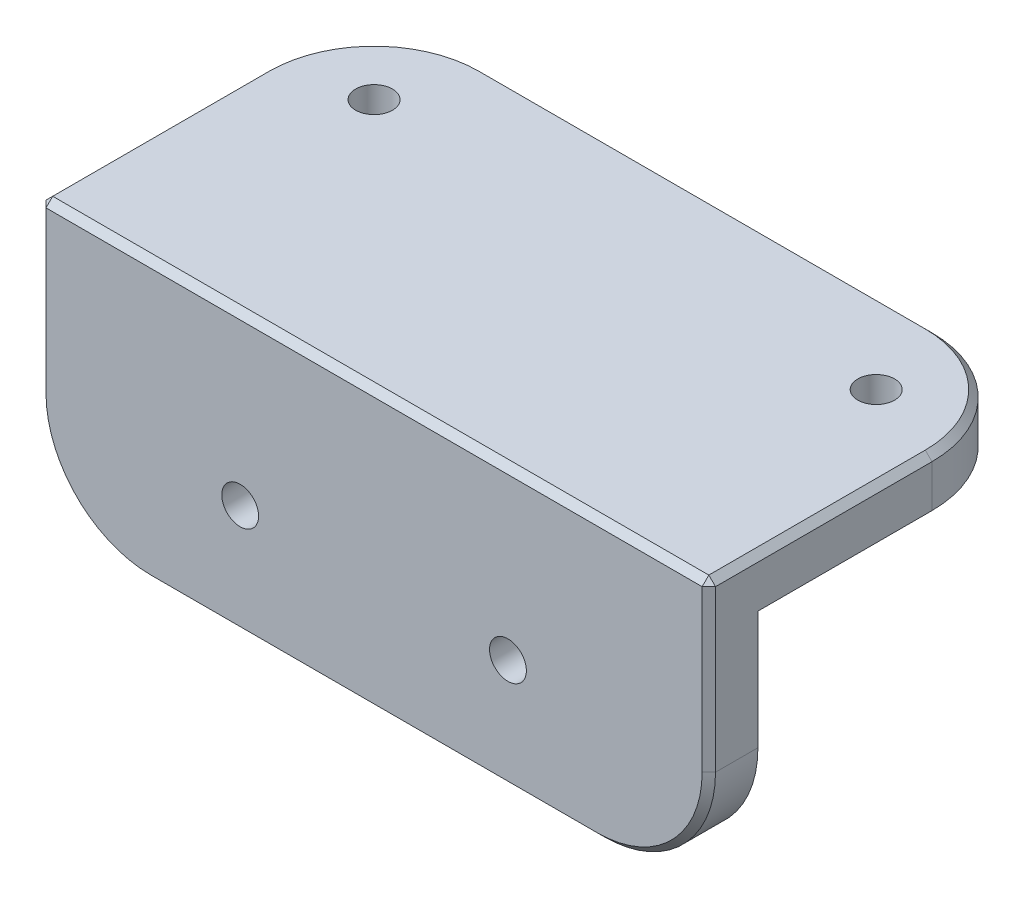
ISO-10303-21;
HEADER;
FILE_DESCRIPTION(('STEP AP214'),'2;1');
FILE_NAME('part.step','',(''),(''),'','','');
FILE_SCHEMA(('AUTOMOTIVE_DESIGN { 1 0 10303 214 1 1 1 1 }'));
ENDSEC;
DATA;
#1=APPLICATION_CONTEXT('core data for automotive mechanical design processes');
#2=APPLICATION_PROTOCOL_DEFINITION('international standard','automotive_design',2000,#1);
#3=PRODUCT_CONTEXT('',#1,'mechanical');
#4=PRODUCT('Part','Part','',(#3));
#5=PRODUCT_RELATED_PRODUCT_CATEGORY('part','',(#4));
#6=PRODUCT_DEFINITION_FORMATION('','',#4);
#7=PRODUCT_DEFINITION_CONTEXT('part definition',#1,'design');
#8=PRODUCT_DEFINITION('design','',#6,#7);
#9=PRODUCT_DEFINITION_SHAPE('','',#8);
#10=(LENGTH_UNIT() NAMED_UNIT(*) SI_UNIT(.MILLI.,.METRE.));
#11=(NAMED_UNIT(*) PLANE_ANGLE_UNIT() SI_UNIT($,.RADIAN.));
#12=(NAMED_UNIT(*) SI_UNIT($,.STERADIAN.) SOLID_ANGLE_UNIT());
#13=UNCERTAINTY_MEASURE_WITH_UNIT(LENGTH_MEASURE(1.E-05),#10,'distance_accuracy_value','');
#14=(GEOMETRIC_REPRESENTATION_CONTEXT(3) GLOBAL_UNCERTAINTY_ASSIGNED_CONTEXT((#13)) GLOBAL_UNIT_ASSIGNED_CONTEXT((#10,
#11,#12)) REPRESENTATION_CONTEXT('',''));
#15=CARTESIAN_POINT('',(0.,0.,0.));
#16=DIRECTION('',(0.,0.,1.));
#17=DIRECTION('',(1.,0.,0.));
#18=AXIS2_PLACEMENT_3D('',#15,#16,#17);
#19=CARTESIAN_POINT('',(30.,5.,15.));
#20=DIRECTION('',(-1.,0.,0.));
#21=DIRECTION('',(0.,0.,1.));
#22=AXIS2_PLACEMENT_3D('',#19,#20,#21);
#23=PLANE('',#22);
#24=DIRECTION('',(0.,1.,0.));
#25=VECTOR('',#24,1.);
#26=CARTESIAN_POINT('',(30.,5.,10.6));
#27=LINE('',#26,#25);
#28=CARTESIAN_POINT('',(30.,-10.,10.6));
#29=VERTEX_POINT('',#28);
#30=CARTESIAN_POINT('',(30.,0.600000000000003,10.6));
#31=VERTEX_POINT('',#30);
#32=EDGE_CURVE('E358',#29,#31,#27,.T.);
#33=ORIENTED_EDGE('',*,*,#32,.T.);
#34=DIRECTION('',(0.,0.,-1.));
#35=VECTOR('',#34,1.);
#36=CARTESIAN_POINT('',(30.,0.600000000000003,-5.));
#37=LINE('',#36,#35);
#38=CARTESIAN_POINT('',(30.,0.600000000000003,-5.));
#39=VERTEX_POINT('',#38);
#40=EDGE_CURVE('E355',#31,#39,#37,.T.);
#41=ORIENTED_EDGE('',*,*,#40,.T.);
#42=DIRECTION('',(0.,-1.,0.));
#43=VECTOR('',#42,1.);
#44=CARTESIAN_POINT('',(30.,5.,-5.));
#45=LINE('',#44,#43);
#46=CARTESIAN_POINT('',(30.,4.4,-5.));
#47=VERTEX_POINT('',#46);
#48=EDGE_CURVE('E211',#39,#47,#45,.F.);
#49=ORIENTED_EDGE('',*,*,#48,.T.);
#50=DIRECTION('',(0.,0.,1.));
#51=VECTOR('',#50,1.);
#52=CARTESIAN_POINT('',(30.,4.4,15.));
#53=LINE('',#52,#51);
#54=CARTESIAN_POINT('',(30.,4.4,14.4));
#55=VERTEX_POINT('',#54);
#56=EDGE_CURVE('E361',#47,#55,#53,.T.);
#57=ORIENTED_EDGE('',*,*,#56,.T.);
#58=DIRECTION('',(0.,-1.,0.));
#59=VECTOR('',#58,1.);
#60=CARTESIAN_POINT('',(30.,5.,14.4));
#61=LINE('',#60,#59);
#62=CARTESIAN_POINT('',(30.,-10.,14.4));
#63=VERTEX_POINT('',#62);
#64=EDGE_CURVE('E364',#55,#63,#61,.T.);
#65=ORIENTED_EDGE('',*,*,#64,.T.);
#66=DIRECTION('',(0.,0.,1.));
#67=VECTOR('',#66,1.);
#68=CARTESIAN_POINT('',(30.,-10.,10.));
#69=LINE('',#68,#67);
#70=EDGE_CURVE('E444',#63,#29,#69,.F.);
#71=ORIENTED_EDGE('',*,*,#70,.T.);
#72=EDGE_LOOP('',(#33,#41,#49,#57,#65,#71));
#73=FACE_BOUND('',#72,.T.);
#74=ADVANCED_FACE('F41',(#73),#23,.F.);
#75=CARTESIAN_POINT('',(-30.,5.,-15.));
#76=DIRECTION('',(0.,0.,1.));
#77=DIRECTION('',(1.,0.,0.));
#78=AXIS2_PLACEMENT_3D('',#75,#76,#77);
#79=PLANE('',#78);
#80=DIRECTION('',(0.,-1.,0.));
#81=VECTOR('',#80,1.);
#82=CARTESIAN_POINT('',(20.,5.,-15.));
#83=LINE('',#82,#81);
#84=CARTESIAN_POINT('',(20.,4.4,-15.));
#85=VERTEX_POINT('',#84);
#86=CARTESIAN_POINT('',(20.,0.600000000000003,-15.));
#87=VERTEX_POINT('',#86);
#88=EDGE_CURVE('E440',#85,#87,#83,.T.);
#89=ORIENTED_EDGE('',*,*,#88,.T.);
#90=DIRECTION('',(-1.,0.,0.));
#91=VECTOR('',#90,1.);
#92=CARTESIAN_POINT('',(-20.,0.600000000000003,-15.));
#93=LINE('',#92,#91);
#94=CARTESIAN_POINT('',(-20.,0.600000000000003,-15.));
#95=VERTEX_POINT('',#94);
#96=EDGE_CURVE('E385',#87,#95,#93,.T.);
#97=ORIENTED_EDGE('',*,*,#96,.T.);
#98=DIRECTION('',(0.,-1.,0.));
#99=VECTOR('',#98,1.);
#100=CARTESIAN_POINT('',(-20.,5.,-15.));
#101=LINE('',#100,#99);
#102=CARTESIAN_POINT('',(-20.,4.4,-15.));
#103=VERTEX_POINT('',#102);
#104=EDGE_CURVE('E436',#95,#103,#101,.F.);
#105=ORIENTED_EDGE('',*,*,#104,.T.);
#106=DIRECTION('',(1.,0.,0.));
#107=VECTOR('',#106,1.);
#108=CARTESIAN_POINT('',(-30.,4.4,-15.));
#109=LINE('',#108,#107);
#110=EDGE_CURVE('E224',#103,#85,#109,.T.);
#111=ORIENTED_EDGE('',*,*,#110,.T.);
#112=EDGE_LOOP('',(#89,#97,#105,#111));
#113=FACE_BOUND('',#112,.T.);
#114=ADVANCED_FACE('F566',(#113),#79,.F.);
#115=CARTESIAN_POINT('',(-30.,5.,15.));
#116=DIRECTION('',(1.,0.,0.));
#117=DIRECTION('',(0.,0.,-1.));
#118=AXIS2_PLACEMENT_3D('',#115,#116,#117);
#119=PLANE('',#118);
#120=DIRECTION('',(0.,-1.,0.));
#121=VECTOR('',#120,1.);
#122=CARTESIAN_POINT('',(-30.,5.,-5.));
#123=LINE('',#122,#121);
#124=CARTESIAN_POINT('',(-30.,4.4,-5.));
#125=VERTEX_POINT('',#124);
#126=CARTESIAN_POINT('',(-30.,0.600000000000003,-5.));
#127=VERTEX_POINT('',#126);
#128=EDGE_CURVE('E212',#125,#127,#123,.T.);
#129=ORIENTED_EDGE('',*,*,#128,.T.);
#130=DIRECTION('',(0.,0.,1.));
#131=VECTOR('',#130,1.);
#132=CARTESIAN_POINT('',(-30.,0.600000000000003,10.));
#133=LINE('',#132,#131);
#134=CARTESIAN_POINT('',(-30.,0.600000000000003,10.6));
#135=VERTEX_POINT('',#134);
#136=EDGE_CURVE('E195',#127,#135,#133,.T.);
#137=ORIENTED_EDGE('',*,*,#136,.T.);
#138=DIRECTION('',(0.,-1.,0.));
#139=VECTOR('',#138,1.);
#140=CARTESIAN_POINT('',(-30.,5.,10.6));
#141=LINE('',#140,#139);
#142=CARTESIAN_POINT('',(-30.,-10.,10.6));
#143=VERTEX_POINT('',#142);
#144=EDGE_CURVE('E189',#135,#143,#141,.T.);
#145=ORIENTED_EDGE('',*,*,#144,.T.);
#146=DIRECTION('',(0.,0.,-1.));
#147=VECTOR('',#146,1.);
#148=CARTESIAN_POINT('',(-30.,-10.,15.));
#149=LINE('',#148,#147);
#150=CARTESIAN_POINT('',(-30.,-10.,14.4));
#151=VERTEX_POINT('',#150);
#152=EDGE_CURVE('E193',#143,#151,#149,.F.);
#153=ORIENTED_EDGE('',*,*,#152,.T.);
#154=DIRECTION('',(0.,1.,0.));
#155=VECTOR('',#154,1.);
#156=CARTESIAN_POINT('',(-30.,5.,14.4));
#157=LINE('',#156,#155);
#158=CARTESIAN_POINT('',(-30.,4.4,14.4));
#159=VERTEX_POINT('',#158);
#160=EDGE_CURVE('E433',#151,#159,#157,.T.);
#161=ORIENTED_EDGE('',*,*,#160,.T.);
#162=DIRECTION('',(0.,0.,-1.));
#163=VECTOR('',#162,1.);
#164=CARTESIAN_POINT('',(-30.,4.4,15.));
#165=LINE('',#164,#163);
#166=EDGE_CURVE('E200',#159,#125,#165,.T.);
#167=ORIENTED_EDGE('',*,*,#166,.T.);
#168=EDGE_LOOP('',(#129,#137,#145,#153,#161,#167));
#169=FACE_BOUND('',#168,.T.);
#170=ADVANCED_FACE('F192',(#169),#119,.F.);
#171=CARTESIAN_POINT('',(-30.,5.,15.));
#172=DIRECTION('',(0.,0.,-1.));
#173=DIRECTION('',(-1.,0.,0.));
#174=AXIS2_PLACEMENT_3D('',#171,#172,#173);
#175=PLANE('',#174);
#176=DIRECTION('',(-1.,0.,0.));
#177=VECTOR('',#176,1.);
#178=CARTESIAN_POINT('',(-30.,4.4,15.));
#179=LINE('',#178,#177);
#180=CARTESIAN_POINT('',(29.4,4.4,15.));
#181=VERTEX_POINT('',#180);
#182=CARTESIAN_POINT('',(-29.4,4.4,15.));
#183=VERTEX_POINT('',#182);
#184=EDGE_CURVE('E333',#181,#183,#179,.T.);
#185=ORIENTED_EDGE('',*,*,#184,.T.);
#186=DIRECTION('',(0.,-1.,0.));
#187=VECTOR('',#186,1.);
#188=CARTESIAN_POINT('',(-29.4,5.,15.));
#189=LINE('',#188,#187);
#190=CARTESIAN_POINT('',(-29.4,-10.,15.));
#191=VERTEX_POINT('',#190);
#192=EDGE_CURVE('E11',#183,#191,#189,.T.);
#193=ORIENTED_EDGE('',*,*,#192,.T.);
#194=CARTESIAN_POINT('',(-20.,-10.,15.));
#195=DIRECTION('',(0.,0.,-1.));
#196=DIRECTION('',(-1.,0.,0.));
#197=AXIS2_PLACEMENT_3D('',#194,#195,#196);
#198=CIRCLE('',#197,9.4);
#199=CARTESIAN_POINT('',(-20.,-19.4,15.));
#200=VERTEX_POINT('',#199);
#201=EDGE_CURVE('E52',#191,#200,#198,.F.);
#202=ORIENTED_EDGE('',*,*,#201,.T.);
#203=DIRECTION('',(1.,0.,0.));
#204=VECTOR('',#203,1.);
#205=CARTESIAN_POINT('',(20.,-19.4,15.));
#206=LINE('',#205,#204);
#207=CARTESIAN_POINT('',(20.,-19.4,15.));
#208=VERTEX_POINT('',#207);
#209=EDGE_CURVE('E324',#200,#208,#206,.T.);
#210=ORIENTED_EDGE('',*,*,#209,.T.);
#211=CARTESIAN_POINT('',(20.,-10.,15.));
#212=DIRECTION('',(0.,0.,-1.));
#213=DIRECTION('',(-1.,0.,0.));
#214=AXIS2_PLACEMENT_3D('',#211,#212,#213);
#215=CIRCLE('',#214,9.40000000000001);
#216=CARTESIAN_POINT('',(29.4,-10.,15.));
#217=VERTEX_POINT('',#216);
#218=EDGE_CURVE('E327',#208,#217,#215,.F.);
#219=ORIENTED_EDGE('',*,*,#218,.T.);
#220=DIRECTION('',(0.,1.,0.));
#221=VECTOR('',#220,1.);
#222=CARTESIAN_POINT('',(29.4,5.,15.));
#223=LINE('',#222,#221);
#224=EDGE_CURVE('E330',#217,#181,#223,.T.);
#225=ORIENTED_EDGE('',*,*,#224,.T.);
#226=EDGE_LOOP('',(#185,#193,#202,#210,#219,#225));
#227=FACE_BOUND('',#226,.T.);
#228=CARTESIAN_POINT('',(12.,-10.,15.));
#229=DIRECTION('',(0.,0.,-1.));
#230=DIRECTION('',(-1.,0.,0.));
#231=AXIS2_PLACEMENT_3D('',#228,#229,#230);
#232=CIRCLE('',#231,1.65);
#233=CARTESIAN_POINT('',(10.35,-10.,15.));
#234=VERTEX_POINT('',#233);
#235=EDGE_CURVE('E480',#234,#234,#232,.T.);
#236=ORIENTED_EDGE('',*,*,#235,.T.);
#237=EDGE_LOOP('',(#236));
#238=FACE_BOUND('',#237,.T.);
#239=CARTESIAN_POINT('',(-12.,-10.,15.));
#240=DIRECTION('',(0.,0.,-1.));
#241=DIRECTION('',(-1.,0.,0.));
#242=AXIS2_PLACEMENT_3D('',#239,#240,#241);
#243=CIRCLE('',#242,1.65);
#244=CARTESIAN_POINT('',(-13.65,-10.,15.));
#245=VERTEX_POINT('',#244);
#246=EDGE_CURVE('E484',#245,#245,#243,.T.);
#247=ORIENTED_EDGE('',*,*,#246,.T.);
#248=EDGE_LOOP('',(#247));
#249=FACE_BOUND('',#248,.T.);
#250=ADVANCED_FACE('F631',(#227,#238,#249),#175,.F.);
#251=CARTESIAN_POINT('',(0.,5.,0.));
#252=DIRECTION('',(0.,-1.,0.));
#253=DIRECTION('',(0.,0.,-1.));
#254=AXIS2_PLACEMENT_3D('',#251,#252,#253);
#255=PLANE('',#254);
#256=CARTESIAN_POINT('',(-20.,5.,-5.));
#257=DIRECTION('',(0.,-1.,0.));
#258=DIRECTION('',(0.,0.,-1.));
#259=AXIS2_PLACEMENT_3D('',#256,#257,#258);
#260=CIRCLE('',#259,9.40000000000001);
#261=CARTESIAN_POINT('',(-20.,5.,-14.4));
#262=VERTEX_POINT('',#261);
#263=CARTESIAN_POINT('',(-29.4,5.,-5.));
#264=VERTEX_POINT('',#263);
#265=EDGE_CURVE('E340',#262,#264,#260,.F.);
#266=ORIENTED_EDGE('',*,*,#265,.T.);
#267=DIRECTION('',(0.,0.,1.));
#268=VECTOR('',#267,1.);
#269=CARTESIAN_POINT('',(-29.4,5.,0.));
#270=LINE('',#269,#268);
#271=CARTESIAN_POINT('',(-29.4,5.,14.4));
#272=VERTEX_POINT('',#271);
#273=EDGE_CURVE('E336',#264,#272,#270,.T.);
#274=ORIENTED_EDGE('',*,*,#273,.T.);
#275=DIRECTION('',(1.,0.,0.));
#276=VECTOR('',#275,1.);
#277=CARTESIAN_POINT('',(0.,5.,14.4));
#278=LINE('',#277,#276);
#279=CARTESIAN_POINT('',(29.4,5.,14.4));
#280=VERTEX_POINT('',#279);
#281=EDGE_CURVE('E352',#272,#280,#278,.T.);
#282=ORIENTED_EDGE('',*,*,#281,.T.);
#283=DIRECTION('',(0.,0.,-1.));
#284=VECTOR('',#283,1.);
#285=CARTESIAN_POINT('',(29.4,5.,0.));
#286=LINE('',#285,#284);
#287=CARTESIAN_POINT('',(29.4,5.,-5.));
#288=VERTEX_POINT('',#287);
#289=EDGE_CURVE('E349',#280,#288,#286,.T.);
#290=ORIENTED_EDGE('',*,*,#289,.T.);
#291=CARTESIAN_POINT('',(20.,5.,-5.));
#292=DIRECTION('',(0.,-1.,0.));
#293=DIRECTION('',(0.,0.,-1.));
#294=AXIS2_PLACEMENT_3D('',#291,#292,#293);
#295=CIRCLE('',#294,9.4);
#296=CARTESIAN_POINT('',(20.,5.,-14.4));
#297=VERTEX_POINT('',#296);
#298=EDGE_CURVE('E346',#288,#297,#295,.F.);
#299=ORIENTED_EDGE('',*,*,#298,.T.);
#300=DIRECTION('',(-1.,0.,0.));
#301=VECTOR('',#300,1.);
#302=CARTESIAN_POINT('',(0.,5.,-14.4));
#303=LINE('',#302,#301);
#304=EDGE_CURVE('E343',#297,#262,#303,.T.);
#305=ORIENTED_EDGE('',*,*,#304,.T.);
#306=EDGE_LOOP('',(#266,#274,#282,#290,#299,#305));
#307=FACE_BOUND('',#306,.T.);
#308=CARTESIAN_POINT('',(-22.5,5.,-7.5));
#309=DIRECTION('',(0.,1.,0.));
#310=DIRECTION('',(0.,0.,1.));
#311=AXIS2_PLACEMENT_3D('',#308,#309,#310);
#312=CIRCLE('',#311,1.65);
#313=CARTESIAN_POINT('',(-22.5,5.,-5.85));
#314=VERTEX_POINT('',#313);
#315=EDGE_CURVE('E470',#314,#314,#312,.T.);
#316=ORIENTED_EDGE('',*,*,#315,.F.);
#317=EDGE_LOOP('',(#316));
#318=FACE_BOUND('',#317,.T.);
#319=CARTESIAN_POINT('',(22.5,5.,-7.5));
#320=DIRECTION('',(0.,1.,0.));
#321=DIRECTION('',(0.,0.,1.));
#322=AXIS2_PLACEMENT_3D('',#319,#320,#321);
#323=CIRCLE('',#322,1.65);
#324=CARTESIAN_POINT('',(22.5,5.,-5.85));
#325=VERTEX_POINT('',#324);
#326=EDGE_CURVE('E461',#325,#325,#323,.T.);
#327=ORIENTED_EDGE('',*,*,#326,.F.);
#328=EDGE_LOOP('',(#327));
#329=FACE_BOUND('',#328,.T.);
#330=ADVANCED_FACE('F615',(#307,#318,#329),#255,.F.);
#331=CARTESIAN_POINT('',(0.,0.,0.));
#332=DIRECTION('',(0.,-1.,0.));
#333=DIRECTION('',(0.,0.,-1.));
#334=AXIS2_PLACEMENT_3D('',#331,#332,#333);
#335=PLANE('',#334);
#336=DIRECTION('',(1.,0.,0.));
#337=VECTOR('',#336,1.);
#338=CARTESIAN_POINT('',(-30.,0.,10.));
#339=LINE('',#338,#337);
#340=CARTESIAN_POINT('',(-29.4,0.,10.));
#341=VERTEX_POINT('',#340);
#342=CARTESIAN_POINT('',(29.4,0.,10.));
#343=VERTEX_POINT('',#342);
#344=EDGE_CURVE('E466',#341,#343,#339,.T.);
#345=ORIENTED_EDGE('',*,*,#344,.F.);
#346=DIRECTION('',(0.,0.,-1.));
#347=VECTOR('',#346,1.);
#348=CARTESIAN_POINT('',(-29.4,0.,-5.));
#349=LINE('',#348,#347);
#350=CARTESIAN_POINT('',(-29.4,0.,-5.));
#351=VERTEX_POINT('',#350);
#352=EDGE_CURVE('E412',#341,#351,#349,.T.);
#353=ORIENTED_EDGE('',*,*,#352,.T.);
#354=CARTESIAN_POINT('',(-20.,0.,-5.));
#355=DIRECTION('',(0.,-1.,0.));
#356=DIRECTION('',(0.,0.,-1.));
#357=AXIS2_PLACEMENT_3D('',#354,#355,#356);
#358=CIRCLE('',#357,9.39999999999999);
#359=CARTESIAN_POINT('',(-20.,0.,-14.4));
#360=VERTEX_POINT('',#359);
#361=EDGE_CURVE('E416',#351,#360,#358,.T.);
#362=ORIENTED_EDGE('',*,*,#361,.T.);
#363=DIRECTION('',(1.,0.,0.));
#364=VECTOR('',#363,1.);
#365=CARTESIAN_POINT('',(20.,0.,-14.4));
#366=LINE('',#365,#364);
#367=CARTESIAN_POINT('',(20.,0.,-14.4));
#368=VERTEX_POINT('',#367);
#369=EDGE_CURVE('E419',#360,#368,#366,.T.);
#370=ORIENTED_EDGE('',*,*,#369,.T.);
#371=CARTESIAN_POINT('',(20.,0.,-5.));
#372=DIRECTION('',(0.,-1.,0.));
#373=DIRECTION('',(0.,0.,-1.));
#374=AXIS2_PLACEMENT_3D('',#371,#372,#373);
#375=CIRCLE('',#374,9.39999999999999);
#376=CARTESIAN_POINT('',(29.4,0.,-5.));
#377=VERTEX_POINT('',#376);
#378=EDGE_CURVE('E422',#368,#377,#375,.T.);
#379=ORIENTED_EDGE('',*,*,#378,.T.);
#380=DIRECTION('',(0.,0.,1.));
#381=VECTOR('',#380,1.);
#382=CARTESIAN_POINT('',(29.4,0.,10.));
#383=LINE('',#382,#381);
#384=EDGE_CURVE('E425',#377,#343,#383,.T.);
#385=ORIENTED_EDGE('',*,*,#384,.T.);
#386=EDGE_LOOP('',(#345,#353,#362,#370,#379,#385));
#387=FACE_BOUND('',#386,.T.);
#388=CARTESIAN_POINT('',(-22.5,0.,-7.5));
#389=DIRECTION('',(0.,1.,0.));
#390=DIRECTION('',(0.,0.,1.));
#391=AXIS2_PLACEMENT_3D('',#388,#389,#390);
#392=CIRCLE('',#391,1.65);
#393=CARTESIAN_POINT('',(-22.5,0.,-5.85));
#394=VERTEX_POINT('',#393);
#395=EDGE_CURVE('E460',#394,#394,#392,.T.);
#396=ORIENTED_EDGE('',*,*,#395,.T.);
#397=EDGE_LOOP('',(#396));
#398=FACE_BOUND('',#397,.T.);
#399=CARTESIAN_POINT('',(22.5,0.,-7.5));
#400=DIRECTION('',(0.,1.,0.));
#401=DIRECTION('',(0.,0.,1.));
#402=AXIS2_PLACEMENT_3D('',#399,#400,#401);
#403=CIRCLE('',#402,1.65);
#404=CARTESIAN_POINT('',(22.5,0.,-5.85));
#405=VERTEX_POINT('',#404);
#406=EDGE_CURVE('E465',#405,#405,#403,.T.);
#407=ORIENTED_EDGE('',*,*,#406,.T.);
#408=EDGE_LOOP('',(#407));
#409=FACE_BOUND('',#408,.T.);
#410=ADVANCED_FACE('F656',(#387,#398,#409),#335,.T.);
#411=CARTESIAN_POINT('',(22.5,0.,-7.5));
#412=DIRECTION('',(0.,1.,0.));
#413=DIRECTION('',(0.,0.,1.));
#414=AXIS2_PLACEMENT_3D('',#411,#412,#413);
#415=CYLINDRICAL_SURFACE('',#414,1.65);
#416=ORIENTED_EDGE('',*,*,#406,.F.);
#417=EDGE_LOOP('',(#416));
#418=FACE_BOUND('',#417,.T.);
#419=ORIENTED_EDGE('',*,*,#326,.T.);
#420=EDGE_LOOP('',(#419));
#421=FACE_BOUND('',#420,.T.);
#422=ADVANCED_FACE('F652',(#418,#421),#415,.F.);
#423=CARTESIAN_POINT('',(-22.5,0.,-7.5));
#424=DIRECTION('',(0.,1.,0.));
#425=DIRECTION('',(0.,0.,1.));
#426=AXIS2_PLACEMENT_3D('',#423,#424,#425);
#427=CYLINDRICAL_SURFACE('',#426,1.65);
#428=ORIENTED_EDGE('',*,*,#395,.F.);
#429=EDGE_LOOP('',(#428));
#430=FACE_BOUND('',#429,.T.);
#431=ORIENTED_EDGE('',*,*,#315,.T.);
#432=EDGE_LOOP('',(#431));
#433=FACE_BOUND('',#432,.T.);
#434=ADVANCED_FACE('F503',(#430,#433),#427,.F.);
#435=CARTESIAN_POINT('',(-30.,-20.,10.));
#436=DIRECTION('',(0.,0.,1.));
#437=DIRECTION('',(1.,0.,0.));
#438=AXIS2_PLACEMENT_3D('',#435,#436,#437);
#439=PLANE('',#438);
#440=CARTESIAN_POINT('',(12.,-10.,10.));
#441=DIRECTION('',(0.,0.,-1.));
#442=DIRECTION('',(-1.,0.,0.));
#443=AXIS2_PLACEMENT_3D('',#440,#441,#442);
#444=CIRCLE('',#443,1.65);
#445=CARTESIAN_POINT('',(10.35,-10.,10.));
#446=VERTEX_POINT('',#445);
#447=EDGE_CURVE('E488',#446,#446,#444,.T.);
#448=ORIENTED_EDGE('',*,*,#447,.F.);
#449=EDGE_LOOP('',(#448));
#450=FACE_BOUND('',#449,.T.);
#451=CARTESIAN_POINT('',(-12.,-10.,10.));
#452=DIRECTION('',(0.,0.,-1.));
#453=DIRECTION('',(1.,0.,0.));
#454=AXIS2_PLACEMENT_3D('',#451,#452,#453);
#455=CIRCLE('',#454,1.65);
#456=CARTESIAN_POINT('',(-10.35,-10.,10.));
#457=VERTEX_POINT('',#456);
#458=EDGE_CURVE('E262',#457,#457,#455,.T.);
#459=ORIENTED_EDGE('',*,*,#458,.F.);
#460=EDGE_LOOP('',(#459));
#461=FACE_BOUND('',#460,.T.);
#462=CARTESIAN_POINT('',(-20.,-10.,10.));
#463=DIRECTION('',(0.,0.,1.));
#464=DIRECTION('',(1.,0.,0.));
#465=AXIS2_PLACEMENT_3D('',#462,#463,#464);
#466=CIRCLE('',#465,9.39999999999999);
#467=CARTESIAN_POINT('',(-20.,-19.4,10.));
#468=VERTEX_POINT('',#467);
#469=CARTESIAN_POINT('',(-29.4,-10.,10.));
#470=VERTEX_POINT('',#469);
#471=EDGE_CURVE('E400',#468,#470,#466,.F.);
#472=ORIENTED_EDGE('',*,*,#471,.T.);
#473=DIRECTION('',(0.,1.,0.));
#474=VECTOR('',#473,1.);
#475=CARTESIAN_POINT('',(-29.4,-20.,10.));
#476=LINE('',#475,#474);
#477=EDGE_CURVE('E227',#470,#341,#476,.T.);
#478=ORIENTED_EDGE('',*,*,#477,.T.);
#479=ORIENTED_EDGE('',*,*,#344,.T.);
#480=DIRECTION('',(0.,-1.,0.));
#481=VECTOR('',#480,1.);
#482=CARTESIAN_POINT('',(29.4,-20.,10.));
#483=LINE('',#482,#481);
#484=CARTESIAN_POINT('',(29.4,-10.,10.));
#485=VERTEX_POINT('',#484);
#486=EDGE_CURVE('E409',#343,#485,#483,.T.);
#487=ORIENTED_EDGE('',*,*,#486,.T.);
#488=CARTESIAN_POINT('',(20.,-10.,10.));
#489=DIRECTION('',(0.,0.,1.));
#490=DIRECTION('',(1.,0.,0.));
#491=AXIS2_PLACEMENT_3D('',#488,#489,#490);
#492=CIRCLE('',#491,9.39999999999999);
#493=CARTESIAN_POINT('',(20.,-19.4,10.));
#494=VERTEX_POINT('',#493);
#495=EDGE_CURVE('E406',#485,#494,#492,.F.);
#496=ORIENTED_EDGE('',*,*,#495,.T.);
#497=DIRECTION('',(-1.,0.,0.));
#498=VECTOR('',#497,1.);
#499=CARTESIAN_POINT('',(-20.,-19.4,10.));
#500=LINE('',#499,#498);
#501=EDGE_CURVE('E403',#494,#468,#500,.T.);
#502=ORIENTED_EDGE('',*,*,#501,.T.);
#503=EDGE_LOOP('',(#472,#478,#479,#487,#496,#502));
#504=FACE_BOUND('',#503,.T.);
#505=ADVANCED_FACE('F499',(#450,#461,#504),#439,.F.);
#506=CARTESIAN_POINT('',(0.,-20.,0.));
#507=DIRECTION('',(0.,-1.,0.));
#508=DIRECTION('',(0.,0.,-1.));
#509=AXIS2_PLACEMENT_3D('',#506,#507,#508);
#510=PLANE('',#509);
#511=DIRECTION('',(0.,0.,-1.));
#512=VECTOR('',#511,1.);
#513=CARTESIAN_POINT('',(-20.,-20.,10.));
#514=LINE('',#513,#512);
#515=CARTESIAN_POINT('',(-20.,-20.,14.4));
#516=VERTEX_POINT('',#515);
#517=CARTESIAN_POINT('',(-20.,-20.,10.6));
#518=VERTEX_POINT('',#517);
#519=EDGE_CURVE('E453',#516,#518,#514,.T.);
#520=ORIENTED_EDGE('',*,*,#519,.T.);
#521=DIRECTION('',(1.,0.,0.));
#522=VECTOR('',#521,1.);
#523=CARTESIAN_POINT('',(20.,-20.,10.6));
#524=LINE('',#523,#522);
#525=CARTESIAN_POINT('',(20.,-20.,10.6));
#526=VERTEX_POINT('',#525);
#527=EDGE_CURVE('E379',#518,#526,#524,.T.);
#528=ORIENTED_EDGE('',*,*,#527,.T.);
#529=DIRECTION('',(0.,0.,1.));
#530=VECTOR('',#529,1.);
#531=CARTESIAN_POINT('',(20.,-20.,15.));
#532=LINE('',#531,#530);
#533=CARTESIAN_POINT('',(20.,-20.,14.4));
#534=VERTEX_POINT('',#533);
#535=EDGE_CURVE('E456',#526,#534,#532,.T.);
#536=ORIENTED_EDGE('',*,*,#535,.T.);
#537=DIRECTION('',(-1.,0.,0.));
#538=VECTOR('',#537,1.);
#539=CARTESIAN_POINT('',(-20.,-20.,14.4));
#540=LINE('',#539,#538);
#541=EDGE_CURVE('E382',#534,#516,#540,.T.);
#542=ORIENTED_EDGE('',*,*,#541,.T.);
#543=EDGE_LOOP('',(#520,#528,#536,#542));
#544=FACE_BOUND('',#543,.T.);
#545=ADVANCED_FACE('F502',(#544),#510,.T.);
#546=CARTESIAN_POINT('',(-12.,-10.,20.));
#547=DIRECTION('',(0.,0.,-1.));
#548=DIRECTION('',(-1.,0.,0.));
#549=AXIS2_PLACEMENT_3D('',#546,#547,#548);
#550=CYLINDRICAL_SURFACE('',#549,1.65);
#551=ORIENTED_EDGE('',*,*,#458,.T.);
#552=EDGE_LOOP('',(#551));
#553=FACE_BOUND('',#552,.T.);
#554=ORIENTED_EDGE('',*,*,#246,.F.);
#555=EDGE_LOOP('',(#554));
#556=FACE_BOUND('',#555,.T.);
#557=ADVANCED_FACE('F639',(#553,#556),#550,.F.);
#558=CARTESIAN_POINT('',(12.,-10.,20.));
#559=DIRECTION('',(0.,0.,-1.));
#560=DIRECTION('',(-1.,0.,0.));
#561=AXIS2_PLACEMENT_3D('',#558,#559,#560);
#562=CYLINDRICAL_SURFACE('',#561,1.65);
#563=ORIENTED_EDGE('',*,*,#447,.T.);
#564=EDGE_LOOP('',(#563));
#565=FACE_BOUND('',#564,.T.);
#566=ORIENTED_EDGE('',*,*,#235,.F.);
#567=EDGE_LOOP('',(#566));
#568=FACE_BOUND('',#567,.T.);
#569=ADVANCED_FACE('F496',(#565,#568),#562,.F.);
#570=CARTESIAN_POINT('',(-20.,-10.,0.));
#571=DIRECTION('',(0.,0.,1.));
#572=DIRECTION('',(1.,0.,0.));
#573=AXIS2_PLACEMENT_3D('',#570,#571,#572);
#574=CYLINDRICAL_SURFACE('',#573,10.);
#575=ORIENTED_EDGE('',*,*,#152,.F.);
#576=CARTESIAN_POINT('',(-20.,-10.,10.6));
#577=DIRECTION('',(0.,0.,1.));
#578=DIRECTION('',(1.,0.,0.));
#579=AXIS2_PLACEMENT_3D('',#576,#577,#578);
#580=CIRCLE('',#579,10.);
#581=EDGE_CURVE('E206',#143,#518,#580,.T.);
#582=ORIENTED_EDGE('',*,*,#581,.T.);
#583=ORIENTED_EDGE('',*,*,#519,.F.);
#584=CARTESIAN_POINT('',(-20.,-10.,14.4));
#585=DIRECTION('',(0.,0.,-1.));
#586=DIRECTION('',(-1.,0.,0.));
#587=AXIS2_PLACEMENT_3D('',#584,#585,#586);
#588=CIRCLE('',#587,10.);
#589=EDGE_CURVE('E209',#516,#151,#588,.T.);
#590=ORIENTED_EDGE('',*,*,#589,.T.);
#591=EDGE_LOOP('',(#575,#582,#583,#590));
#592=FACE_BOUND('',#591,.T.);
#593=ADVANCED_FACE('F204',(#592),#574,.T.);
#594=CARTESIAN_POINT('',(20.,-10.,0.));
#595=DIRECTION('',(0.,0.,-1.));
#596=DIRECTION('',(-1.,0.,0.));
#597=AXIS2_PLACEMENT_3D('',#594,#595,#596);
#598=CYLINDRICAL_SURFACE('',#597,10.);
#599=ORIENTED_EDGE('',*,*,#535,.F.);
#600=CARTESIAN_POINT('',(20.,-10.,10.6));
#601=DIRECTION('',(0.,0.,1.));
#602=DIRECTION('',(1.,0.,0.));
#603=AXIS2_PLACEMENT_3D('',#600,#601,#602);
#604=CIRCLE('',#603,10.);
#605=EDGE_CURVE('E367',#526,#29,#604,.T.);
#606=ORIENTED_EDGE('',*,*,#605,.T.);
#607=ORIENTED_EDGE('',*,*,#70,.F.);
#608=CARTESIAN_POINT('',(20.,-10.,14.4));
#609=DIRECTION('',(0.,0.,-1.));
#610=DIRECTION('',(-1.,0.,0.));
#611=AXIS2_PLACEMENT_3D('',#608,#609,#610);
#612=CIRCLE('',#611,10.);
#613=EDGE_CURVE('E370',#63,#534,#612,.T.);
#614=ORIENTED_EDGE('',*,*,#613,.T.);
#615=EDGE_LOOP('',(#599,#606,#607,#614));
#616=FACE_BOUND('',#615,.T.);
#617=ADVANCED_FACE('F518',(#616),#598,.T.);
#618=CARTESIAN_POINT('',(-20.,5.,-5.));
#619=DIRECTION('',(0.,-1.,0.));
#620=DIRECTION('',(0.,0.,-1.));
#621=AXIS2_PLACEMENT_3D('',#618,#619,#620);
#622=CYLINDRICAL_SURFACE('',#621,10.);
#623=ORIENTED_EDGE('',*,*,#104,.F.);
#624=CARTESIAN_POINT('',(-20.,0.600000000000003,-5.));
#625=DIRECTION('',(0.,-1.,0.));
#626=DIRECTION('',(0.,0.,-1.));
#627=AXIS2_PLACEMENT_3D('',#624,#625,#626);
#628=CIRCLE('',#627,10.);
#629=EDGE_CURVE('E392',#95,#127,#628,.F.);
#630=ORIENTED_EDGE('',*,*,#629,.T.);
#631=ORIENTED_EDGE('',*,*,#128,.F.);
#632=CARTESIAN_POINT('',(-20.,4.4,-5.));
#633=DIRECTION('',(0.,-1.,0.));
#634=DIRECTION('',(0.,0.,-1.));
#635=AXIS2_PLACEMENT_3D('',#632,#633,#634);
#636=CIRCLE('',#635,10.);
#637=EDGE_CURVE('E395',#125,#103,#636,.T.);
#638=ORIENTED_EDGE('',*,*,#637,.T.);
#639=EDGE_LOOP('',(#623,#630,#631,#638));
#640=FACE_BOUND('',#639,.T.);
#641=ADVANCED_FACE('F547',(#640),#622,.T.);
#642=CARTESIAN_POINT('',(20.,5.,-5.));
#643=DIRECTION('',(0.,-1.,0.));
#644=DIRECTION('',(0.,0.,-1.));
#645=AXIS2_PLACEMENT_3D('',#642,#643,#644);
#646=CYLINDRICAL_SURFACE('',#645,10.);
#647=ORIENTED_EDGE('',*,*,#48,.F.);
#648=CARTESIAN_POINT('',(20.,0.600000000000003,-5.));
#649=DIRECTION('',(0.,-1.,0.));
#650=DIRECTION('',(0.,0.,-1.));
#651=AXIS2_PLACEMENT_3D('',#648,#649,#650);
#652=CIRCLE('',#651,10.);
#653=EDGE_CURVE('E373',#39,#87,#652,.F.);
#654=ORIENTED_EDGE('',*,*,#653,.T.);
#655=ORIENTED_EDGE('',*,*,#88,.F.);
#656=CARTESIAN_POINT('',(20.,4.4,-5.));
#657=DIRECTION('',(0.,-1.,0.));
#658=DIRECTION('',(0.,0.,-1.));
#659=AXIS2_PLACEMENT_3D('',#656,#657,#658);
#660=CIRCLE('',#659,10.);
#661=EDGE_CURVE('E376',#85,#47,#660,.T.);
#662=ORIENTED_EDGE('',*,*,#661,.T.);
#663=EDGE_LOOP('',(#647,#654,#655,#662));
#664=FACE_BOUND('',#663,.T.);
#665=ADVANCED_FACE('F580',(#664),#646,.T.);
#666=CARTESIAN_POINT('',(30.,5.,10.6));
#667=DIRECTION('',(-0.707106781186544,0.,0.707106781186552));
#668=DIRECTION('',(0.,1.,0.));
#669=AXIS2_PLACEMENT_3D('',#666,#667,#668);
#670=PLANE('',#669);
#671=DIRECTION('',(0.707106781186552,0.,0.707106781186544));
#672=VECTOR('',#671,1.);
#673=CARTESIAN_POINT('',(29.4,-10.,10.));
#674=LINE('',#673,#672);
#675=EDGE_CURVE('E254',#485,#29,#674,.T.);
#676=ORIENTED_EDGE('',*,*,#675,.F.);
#677=ORIENTED_EDGE('',*,*,#486,.F.);
#678=DIRECTION('',(-0.57735026918963,-0.577350269189624,-0.577350269189624));
#679=VECTOR('',#678,1.);
#680=CARTESIAN_POINT('',(31.4666666666667,2.06666666666666,12.0666666666667));
#681=LINE('',#680,#679);
#682=EDGE_CURVE('E258',#31,#343,#681,.T.);
#683=ORIENTED_EDGE('',*,*,#682,.F.);
#684=ORIENTED_EDGE('',*,*,#32,.F.);
#685=EDGE_LOOP('',(#676,#677,#683,#684));
#686=FACE_BOUND('',#685,.T.);
#687=ADVANCED_FACE('F527',(#686),#670,.F.);
#688=CARTESIAN_POINT('',(30.,0.600000000000003,15.));
#689=DIRECTION('',(0.707106781186544,-0.707106781186552,0.));
#690=DIRECTION('',(0.,0.,1.));
#691=AXIS2_PLACEMENT_3D('',#688,#689,#690);
#692=PLANE('',#691);
#693=ORIENTED_EDGE('',*,*,#682,.T.);
#694=ORIENTED_EDGE('',*,*,#384,.F.);
#695=DIRECTION('',(-0.707106781186552,-0.707106781186544,0.));
#696=VECTOR('',#695,1.);
#697=CARTESIAN_POINT('',(30.,0.600000000000003,-5.));
#698=LINE('',#697,#696);
#699=EDGE_CURVE('E250',#39,#377,#698,.T.);
#700=ORIENTED_EDGE('',*,*,#699,.F.);
#701=ORIENTED_EDGE('',*,*,#40,.F.);
#702=EDGE_LOOP('',(#693,#694,#700,#701));
#703=FACE_BOUND('',#702,.T.);
#704=ADVANCED_FACE('F586',(#703),#692,.T.);
#705=CARTESIAN_POINT('',(20.,-10.,10.));
#706=DIRECTION('',(0.,0.,1.));
#707=DIRECTION('',(1.,0.,0.));
#708=AXIS2_PLACEMENT_3D('',#705,#706,#707);
#709=CONICAL_SURFACE('',#708,9.39999999999999,0.785398163397454);
#710=ORIENTED_EDGE('',*,*,#675,.T.);
#711=ORIENTED_EDGE('',*,*,#605,.F.);
#712=DIRECTION('',(0.,-0.707106781186552,0.707106781186544));
#713=VECTOR('',#712,1.);
#714=CARTESIAN_POINT('',(20.,-19.4,10.));
#715=LINE('',#714,#713);
#716=EDGE_CURVE('E246',#494,#526,#715,.T.);
#717=ORIENTED_EDGE('',*,*,#716,.F.);
#718=ORIENTED_EDGE('',*,*,#495,.F.);
#719=EDGE_LOOP('',(#710,#711,#717,#718));
#720=FACE_BOUND('',#719,.T.);
#721=ADVANCED_FACE('F522',(#720),#709,.T.);
#722=CARTESIAN_POINT('',(20.,0.,-5.));
#723=DIRECTION('',(0.,1.,0.));
#724=DIRECTION('',(0.,0.,1.));
#725=AXIS2_PLACEMENT_3D('',#722,#723,#724);
#726=CONICAL_SURFACE('',#725,9.39999999999999,0.785398163397454);
#727=ORIENTED_EDGE('',*,*,#699,.T.);
#728=ORIENTED_EDGE('',*,*,#378,.F.);
#729=DIRECTION('',(0.,-0.707106781186542,0.707106781186553));
#730=VECTOR('',#729,1.);
#731=CARTESIAN_POINT('',(20.,0.600000000000003,-15.));
#732=LINE('',#731,#730);
#733=EDGE_CURVE('E242',#87,#368,#732,.T.);
#734=ORIENTED_EDGE('',*,*,#733,.F.);
#735=ORIENTED_EDGE('',*,*,#653,.F.);
#736=EDGE_LOOP('',(#727,#728,#734,#735));
#737=FACE_BOUND('',#736,.T.);
#738=ADVANCED_FACE('F598',(#737),#726,.T.);
#739=CARTESIAN_POINT('',(0.,-20.,10.6));
#740=DIRECTION('',(0.,-0.707106781186544,-0.707106781186552));
#741=DIRECTION('',(-1.,0.,0.));
#742=AXIS2_PLACEMENT_3D('',#739,#740,#741);
#743=PLANE('',#742);
#744=ORIENTED_EDGE('',*,*,#716,.T.);
#745=ORIENTED_EDGE('',*,*,#527,.F.);
#746=DIRECTION('',(0.,-0.707106781186552,0.707106781186544));
#747=VECTOR('',#746,1.);
#748=CARTESIAN_POINT('',(-20.,-19.4,10.));
#749=LINE('',#748,#747);
#750=EDGE_CURVE('E222',#468,#518,#749,.T.);
#751=ORIENTED_EDGE('',*,*,#750,.F.);
#752=ORIENTED_EDGE('',*,*,#501,.F.);
#753=EDGE_LOOP('',(#744,#745,#751,#752));
#754=FACE_BOUND('',#753,.T.);
#755=ADVANCED_FACE('F513',(#754),#743,.T.);
#756=CARTESIAN_POINT('',(-30.,0.600000000000003,-15.));
#757=DIRECTION('',(0.,-0.707106781186552,-0.707106781186544));
#758=DIRECTION('',(1.,0.,0.));
#759=AXIS2_PLACEMENT_3D('',#756,#757,#758);
#760=PLANE('',#759);
#761=ORIENTED_EDGE('',*,*,#733,.T.);
#762=ORIENTED_EDGE('',*,*,#369,.F.);
#763=DIRECTION('',(0.,-0.707106781186544,0.707106781186552));
#764=VECTOR('',#763,1.);
#765=CARTESIAN_POINT('',(-20.,0.600000000000003,-15.));
#766=LINE('',#765,#764);
#767=EDGE_CURVE('E229',#95,#360,#766,.T.);
#768=ORIENTED_EDGE('',*,*,#767,.F.);
#769=ORIENTED_EDGE('',*,*,#96,.F.);
#770=EDGE_LOOP('',(#761,#762,#768,#769));
#771=FACE_BOUND('',#770,.T.);
#772=ADVANCED_FACE('F602',(#771),#760,.T.);
#773=CARTESIAN_POINT('',(-20.,-10.,10.));
#774=DIRECTION('',(0.,0.,1.));
#775=DIRECTION('',(1.,0.,0.));
#776=AXIS2_PLACEMENT_3D('',#773,#774,#775);
#777=CONICAL_SURFACE('',#776,9.39999999999999,0.785398163397453);
#778=ORIENTED_EDGE('',*,*,#750,.T.);
#779=ORIENTED_EDGE('',*,*,#581,.F.);
#780=DIRECTION('',(-0.707106781186552,0.,0.707106781186544));
#781=VECTOR('',#780,1.);
#782=CARTESIAN_POINT('',(-29.4,-10.,10.));
#783=LINE('',#782,#781);
#784=EDGE_CURVE('E219',#470,#143,#783,.T.);
#785=ORIENTED_EDGE('',*,*,#784,.F.);
#786=ORIENTED_EDGE('',*,*,#471,.F.);
#787=EDGE_LOOP('',(#778,#779,#785,#786));
#788=FACE_BOUND('',#787,.T.);
#789=ADVANCED_FACE('F217',(#788),#777,.T.);
#790=CARTESIAN_POINT('',(-20.,0.,-5.));
#791=DIRECTION('',(0.,1.,0.));
#792=DIRECTION('',(0.,0.,1.));
#793=AXIS2_PLACEMENT_3D('',#790,#791,#792);
#794=CONICAL_SURFACE('',#793,9.39999999999999,0.785398163397453);
#795=ORIENTED_EDGE('',*,*,#767,.T.);
#796=ORIENTED_EDGE('',*,*,#361,.F.);
#797=DIRECTION('',(0.707106781186552,-0.707106781186544,0.));
#798=VECTOR('',#797,1.);
#799=CARTESIAN_POINT('',(-30.,0.600000000000003,-5.));
#800=LINE('',#799,#798);
#801=EDGE_CURVE('E230',#127,#351,#800,.T.);
#802=ORIENTED_EDGE('',*,*,#801,.F.);
#803=ORIENTED_EDGE('',*,*,#629,.F.);
#804=EDGE_LOOP('',(#795,#796,#802,#803));
#805=FACE_BOUND('',#804,.T.);
#806=ADVANCED_FACE('F552',(#805),#794,.T.);
#807=CARTESIAN_POINT('',(-29.4,-20.,10.));
#808=DIRECTION('',(0.707106781186544,0.,0.707106781186552));
#809=DIRECTION('',(0.,1.,0.));
#810=AXIS2_PLACEMENT_3D('',#807,#808,#809);
#811=PLANE('',#810);
#812=ORIENTED_EDGE('',*,*,#784,.T.);
#813=ORIENTED_EDGE('',*,*,#144,.F.);
#814=DIRECTION('',(-0.57735026918963,0.577350269189624,0.577350269189624));
#815=VECTOR('',#814,1.);
#816=CARTESIAN_POINT('',(-31.4666666666667,2.06666666666666,12.0666666666667));
#817=LINE('',#816,#815);
#818=EDGE_CURVE('E236',#341,#135,#817,.T.);
#819=ORIENTED_EDGE('',*,*,#818,.F.);
#820=ORIENTED_EDGE('',*,*,#477,.F.);
#821=EDGE_LOOP('',(#812,#813,#819,#820));
#822=FACE_BOUND('',#821,.T.);
#823=ADVANCED_FACE('F226',(#822),#811,.F.);
#824=CARTESIAN_POINT('',(-30.,0.600000000000003,15.));
#825=DIRECTION('',(-0.707106781186544,-0.707106781186552,0.));
#826=DIRECTION('',(0.,0.,-1.));
#827=AXIS2_PLACEMENT_3D('',#824,#825,#826);
#828=PLANE('',#827);
#829=ORIENTED_EDGE('',*,*,#801,.T.);
#830=ORIENTED_EDGE('',*,*,#352,.F.);
#831=ORIENTED_EDGE('',*,*,#818,.T.);
#832=ORIENTED_EDGE('',*,*,#136,.F.);
#833=EDGE_LOOP('',(#829,#830,#831,#832));
#834=FACE_BOUND('',#833,.T.);
#835=ADVANCED_FACE('F554',(#834),#828,.T.);
#836=CARTESIAN_POINT('',(20.,-10.,15.));
#837=DIRECTION('',(0.,0.,-1.));
#838=DIRECTION('',(-1.,0.,0.));
#839=AXIS2_PLACEMENT_3D('',#836,#837,#838);
#840=CONICAL_SURFACE('',#839,9.40000000000001,0.785398163397447);
#841=DIRECTION('',(0.,0.707106781186547,0.707106781186547));
#842=VECTOR('',#841,1.);
#843=CARTESIAN_POINT('',(20.,-20.,14.4));
#844=LINE('',#843,#842);
#845=EDGE_CURVE('E306',#534,#208,#844,.T.);
#846=ORIENTED_EDGE('',*,*,#845,.F.);
#847=ORIENTED_EDGE('',*,*,#613,.F.);
#848=DIRECTION('',(0.707106781186547,0.,-0.707106781186547));
#849=VECTOR('',#848,1.);
#850=CARTESIAN_POINT('',(29.4,-10.,15.));
#851=LINE('',#850,#849);
#852=EDGE_CURVE('E46',#217,#63,#851,.T.);
#853=ORIENTED_EDGE('',*,*,#852,.F.);
#854=ORIENTED_EDGE('',*,*,#218,.F.);
#855=EDGE_LOOP('',(#846,#847,#853,#854));
#856=FACE_BOUND('',#855,.T.);
#857=ADVANCED_FACE('F44',(#856),#840,.T.);
#858=CARTESIAN_POINT('',(29.4,5.,0.));
#859=DIRECTION('',(-0.707106781186547,-0.707106781186547,0.));
#860=DIRECTION('',(0.,0.,-1.));
#861=AXIS2_PLACEMENT_3D('',#858,#859,#860);
#862=PLANE('',#861);
#863=DIRECTION('',(0.707106781186547,-0.707106781186547,0.));
#864=VECTOR('',#863,1.);
#865=CARTESIAN_POINT('',(30.,4.4,14.4));
#866=LINE('',#865,#864);
#867=EDGE_CURVE('E299',#55,#280,#866,.F.);
#868=ORIENTED_EDGE('',*,*,#867,.F.);
#869=ORIENTED_EDGE('',*,*,#56,.F.);
#870=DIRECTION('',(0.707106781186547,-0.707106781186547,0.));
#871=VECTOR('',#870,1.);
#872=CARTESIAN_POINT('',(29.4,5.,-5.));
#873=LINE('',#872,#871);
#874=EDGE_CURVE('E303',#288,#47,#873,.T.);
#875=ORIENTED_EDGE('',*,*,#874,.F.);
#876=ORIENTED_EDGE('',*,*,#289,.F.);
#877=EDGE_LOOP('',(#868,#869,#875,#876));
#878=FACE_BOUND('',#877,.T.);
#879=ADVANCED_FACE('F561',(#878),#862,.F.);
#880=CARTESIAN_POINT('',(30.,5.,14.4));
#881=DIRECTION('',(-0.707106781186547,0.,-0.707106781186547));
#882=DIRECTION('',(0.,-1.,0.));
#883=AXIS2_PLACEMENT_3D('',#880,#881,#882);
#884=PLANE('',#883);
#885=ORIENTED_EDGE('',*,*,#852,.T.);
#886=ORIENTED_EDGE('',*,*,#64,.F.);
#887=DIRECTION('',(-0.707106781186547,0.,0.707106781186547));
#888=VECTOR('',#887,1.);
#889=CARTESIAN_POINT('',(30.,4.4,14.4));
#890=LINE('',#889,#888);
#891=EDGE_CURVE('E295',#181,#55,#890,.F.);
#892=ORIENTED_EDGE('',*,*,#891,.F.);
#893=ORIENTED_EDGE('',*,*,#224,.F.);
#894=EDGE_LOOP('',(#885,#886,#892,#893));
#895=FACE_BOUND('',#894,.T.);
#896=ADVANCED_FACE('F623',(#895),#884,.F.);
#897=CARTESIAN_POINT('',(0.,-20.,14.4));
#898=DIRECTION('',(0.,-0.707106781186547,0.707106781186547));
#899=DIRECTION('',(1.,0.,0.));
#900=AXIS2_PLACEMENT_3D('',#897,#898,#899);
#901=PLANE('',#900);
#902=ORIENTED_EDGE('',*,*,#845,.T.);
#903=ORIENTED_EDGE('',*,*,#209,.F.);
#904=DIRECTION('',(0.,0.707106781186547,0.707106781186547));
#905=VECTOR('',#904,1.);
#906=CARTESIAN_POINT('',(-20.,-20.,14.4));
#907=LINE('',#906,#905);
#908=EDGE_CURVE('E291',#516,#200,#907,.T.);
#909=ORIENTED_EDGE('',*,*,#908,.F.);
#910=ORIENTED_EDGE('',*,*,#541,.F.);
#911=EDGE_LOOP('',(#902,#903,#909,#910));
#912=FACE_BOUND('',#911,.T.);
#913=ADVANCED_FACE('F535',(#912),#901,.T.);
#914=CARTESIAN_POINT('',(20.,5.,-5.));
#915=DIRECTION('',(0.,-1.,0.));
#916=DIRECTION('',(0.,0.,-1.));
#917=AXIS2_PLACEMENT_3D('',#914,#915,#916);
#918=CONICAL_SURFACE('',#917,9.4,0.785398163397448);
#919=ORIENTED_EDGE('',*,*,#874,.T.);
#920=ORIENTED_EDGE('',*,*,#661,.F.);
#921=DIRECTION('',(0.,-0.707106781186547,-0.707106781186547));
#922=VECTOR('',#921,1.);
#923=CARTESIAN_POINT('',(20.,5.,-14.4));
#924=LINE('',#923,#922);
#925=EDGE_CURVE('E287',#297,#85,#924,.T.);
#926=ORIENTED_EDGE('',*,*,#925,.F.);
#927=ORIENTED_EDGE('',*,*,#298,.F.);
#928=EDGE_LOOP('',(#919,#920,#926,#927));
#929=FACE_BOUND('',#928,.T.);
#930=ADVANCED_FACE('F606',(#929),#918,.T.);
#931=CARTESIAN_POINT('',(30.,4.4,14.4));
#932=DIRECTION('',(0.577350269189626,0.577350269189626,0.577350269189626));
#933=DIRECTION('',(0.707106781186547,0.,-0.707106781186547));
#934=AXIS2_PLACEMENT_3D('',#931,#932,#933);
#935=PLANE('',#934);
#936=ORIENTED_EDGE('',*,*,#891,.T.);
#937=ORIENTED_EDGE('',*,*,#867,.T.);
#938=DIRECTION('',(0.,0.707106781186547,-0.707106781186547));
#939=VECTOR('',#938,1.);
#940=CARTESIAN_POINT('',(29.4,4.7,14.7));
#941=LINE('',#940,#939);
#942=EDGE_CURVE('E283',#181,#280,#941,.T.);
#943=ORIENTED_EDGE('',*,*,#942,.F.);
#944=EDGE_LOOP('',(#936,#937,#943));
#945=FACE_BOUND('',#944,.T.);
#946=ADVANCED_FACE('F627',(#945),#935,.T.);
#947=CARTESIAN_POINT('',(-20.,-10.,15.));
#948=DIRECTION('',(0.,0.,-1.));
#949=DIRECTION('',(-1.,0.,0.));
#950=AXIS2_PLACEMENT_3D('',#947,#948,#949);
#951=CONICAL_SURFACE('',#950,9.4,0.785398163397448);
#952=ORIENTED_EDGE('',*,*,#908,.T.);
#953=ORIENTED_EDGE('',*,*,#201,.F.);
#954=DIRECTION('',(0.707106781186547,0.,0.707106781186547));
#955=VECTOR('',#954,1.);
#956=CARTESIAN_POINT('',(-30.,-10.,14.4));
#957=LINE('',#956,#955);
#958=EDGE_CURVE('E60',#151,#191,#957,.T.);
#959=ORIENTED_EDGE('',*,*,#958,.F.);
#960=ORIENTED_EDGE('',*,*,#589,.F.);
#961=EDGE_LOOP('',(#952,#953,#959,#960));
#962=FACE_BOUND('',#961,.T.);
#963=ADVANCED_FACE('F537',(#962),#951,.T.);
#964=CARTESIAN_POINT('',(0.,5.,-14.4));
#965=DIRECTION('',(0.,-0.707106781186547,0.707106781186547));
#966=DIRECTION('',(-1.,0.,0.));
#967=AXIS2_PLACEMENT_3D('',#964,#965,#966);
#968=PLANE('',#967);
#969=ORIENTED_EDGE('',*,*,#925,.T.);
#970=ORIENTED_EDGE('',*,*,#110,.F.);
#971=DIRECTION('',(0.,-0.707106781186547,-0.707106781186547));
#972=VECTOR('',#971,1.);
#973=CARTESIAN_POINT('',(-20.,5.,-14.4));
#974=LINE('',#973,#972);
#975=EDGE_CURVE('E277',#262,#103,#974,.T.);
#976=ORIENTED_EDGE('',*,*,#975,.F.);
#977=ORIENTED_EDGE('',*,*,#304,.F.);
#978=EDGE_LOOP('',(#969,#970,#976,#977));
#979=FACE_BOUND('',#978,.T.);
#980=ADVANCED_FACE('F611',(#979),#968,.F.);
#981=CARTESIAN_POINT('',(0.,5.,14.4));
#982=DIRECTION('',(0.,-0.707106781186547,-0.707106781186547));
#983=DIRECTION('',(1.,0.,0.));
#984=AXIS2_PLACEMENT_3D('',#981,#982,#983);
#985=PLANE('',#984);
#986=ORIENTED_EDGE('',*,*,#942,.T.);
#987=ORIENTED_EDGE('',*,*,#281,.F.);
#988=DIRECTION('',(0.,-0.707106781186547,0.707106781186547));
#989=VECTOR('',#988,1.);
#990=CARTESIAN_POINT('',(-29.4,5.,14.4));
#991=LINE('',#990,#989);
#992=EDGE_CURVE('E273',#183,#272,#991,.F.);
#993=ORIENTED_EDGE('',*,*,#992,.F.);
#994=ORIENTED_EDGE('',*,*,#184,.F.);
#995=EDGE_LOOP('',(#986,#987,#993,#994));
#996=FACE_BOUND('',#995,.T.);
#997=ADVANCED_FACE('F630',(#996),#985,.F.);
#998=CARTESIAN_POINT('',(-29.4,5.,15.));
#999=DIRECTION('',(0.707106781186547,0.,-0.707106781186547));
#1000=DIRECTION('',(0.,-1.,0.));
#1001=AXIS2_PLACEMENT_3D('',#998,#999,#1000);
#1002=PLANE('',#1001);
#1003=ORIENTED_EDGE('',*,*,#958,.T.);
#1004=ORIENTED_EDGE('',*,*,#192,.F.);
#1005=DIRECTION('',(-0.707106781186547,0.,-0.707106781186547));
#1006=VECTOR('',#1005,1.);
#1007=CARTESIAN_POINT('',(-29.7,4.4,14.7));
#1008=LINE('',#1007,#1006);
#1009=EDGE_CURVE('E269',#159,#183,#1008,.F.);
#1010=ORIENTED_EDGE('',*,*,#1009,.F.);
#1011=ORIENTED_EDGE('',*,*,#160,.F.);
#1012=EDGE_LOOP('',(#1003,#1004,#1010,#1011));
#1013=FACE_BOUND('',#1012,.T.);
#1014=ADVANCED_FACE('F539',(#1013),#1002,.F.);
#1015=CARTESIAN_POINT('',(-20.,5.,-5.));
#1016=DIRECTION('',(0.,-1.,0.));
#1017=DIRECTION('',(0.,0.,-1.));
#1018=AXIS2_PLACEMENT_3D('',#1015,#1016,#1017);
#1019=CONICAL_SURFACE('',#1018,9.40000000000001,0.785398163397447);
#1020=ORIENTED_EDGE('',*,*,#975,.T.);
#1021=ORIENTED_EDGE('',*,*,#637,.F.);
#1022=DIRECTION('',(-0.707106781186547,-0.707106781186547,0.));
#1023=VECTOR('',#1022,1.);
#1024=CARTESIAN_POINT('',(-29.4,5.,-5.));
#1025=LINE('',#1024,#1023);
#1026=EDGE_CURVE('E266',#264,#125,#1025,.T.);
#1027=ORIENTED_EDGE('',*,*,#1026,.F.);
#1028=ORIENTED_EDGE('',*,*,#265,.F.);
#1029=EDGE_LOOP('',(#1020,#1021,#1027,#1028));
#1030=FACE_BOUND('',#1029,.T.);
#1031=ADVANCED_FACE('F869',(#1030),#1019,.T.);
#1032=CARTESIAN_POINT('',(-29.4,5.,14.4));
#1033=DIRECTION('',(-0.577350269189626,0.577350269189626,0.577350269189626));
#1034=DIRECTION('',(0.707106781186547,0.,0.707106781186547));
#1035=AXIS2_PLACEMENT_3D('',#1032,#1033,#1034);
#1036=PLANE('',#1035);
#1037=ORIENTED_EDGE('',*,*,#1009,.T.);
#1038=ORIENTED_EDGE('',*,*,#992,.T.);
#1039=DIRECTION('',(0.707106781186547,0.707106781186547,0.));
#1040=VECTOR('',#1039,1.);
#1041=CARTESIAN_POINT('',(-29.4,5.,14.4));
#1042=LINE('',#1041,#1040);
#1043=EDGE_CURVE('E263',#159,#272,#1042,.T.);
#1044=ORIENTED_EDGE('',*,*,#1043,.F.);
#1045=EDGE_LOOP('',(#1037,#1038,#1044));
#1046=FACE_BOUND('',#1045,.T.);
#1047=ADVANCED_FACE('F878',(#1046),#1036,.T.);
#1048=CARTESIAN_POINT('',(-29.4,5.,0.));
#1049=DIRECTION('',(0.707106781186547,-0.707106781186547,0.));
#1050=DIRECTION('',(0.,0.,1.));
#1051=AXIS2_PLACEMENT_3D('',#1048,#1049,#1050);
#1052=PLANE('',#1051);
#1053=ORIENTED_EDGE('',*,*,#1026,.T.);
#1054=ORIENTED_EDGE('',*,*,#166,.F.);
#1055=ORIENTED_EDGE('',*,*,#1043,.T.);
#1056=ORIENTED_EDGE('',*,*,#273,.F.);
#1057=EDGE_LOOP('',(#1053,#1054,#1055,#1056));
#1058=FACE_BOUND('',#1057,.T.);
#1059=ADVANCED_FACE('F888',(#1058),#1052,.F.);
#1060=CLOSED_SHELL('',(#74,#114,#170,#250,#330,#410,#422,#434,#505,#545,#557,#569,#593,#617,
#641,#665,#687,#704,#721,#738,#755,#772,#789,#806,#823,#835,#857,#879,#896,#913,#930,#946,#963,
#980,#997,#1014,#1031,#1047,#1059));
#1061=MANIFOLD_SOLID_BREP('B2',#1060);
#1062=ADVANCED_BREP_SHAPE_REPRESENTATION('',(#18,#1061),#14);
#1063=SHAPE_DEFINITION_REPRESENTATION(#9,#1062);
ENDSEC;
END-ISO-10303-21;
